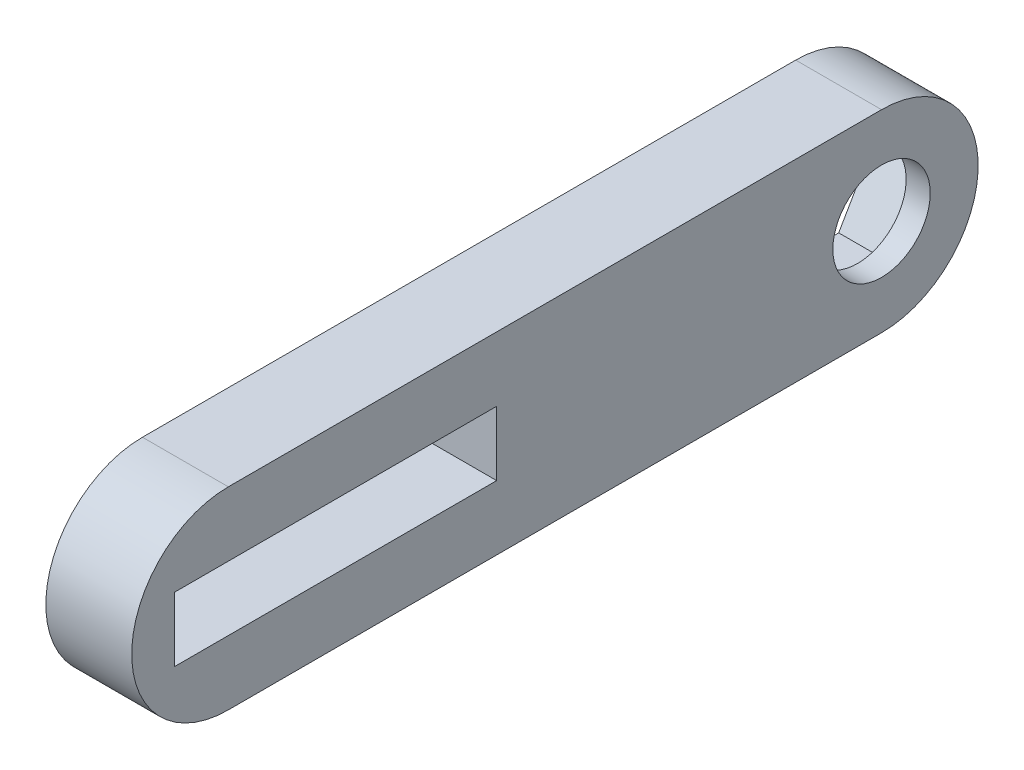
ISO-10303-21;
HEADER;
FILE_DESCRIPTION(('STEP AP214'),'2;1');
FILE_NAME('part.step','',(''),(''),'','','');
FILE_SCHEMA(('AUTOMOTIVE_DESIGN { 1 0 10303 214 1 1 1 1 }'));
ENDSEC;
DATA;
#1=APPLICATION_CONTEXT('core data for automotive mechanical design processes');
#2=APPLICATION_PROTOCOL_DEFINITION('international standard','automotive_design',2000,#1);
#3=PRODUCT_CONTEXT('',#1,'mechanical');
#4=PRODUCT('Part','Part','',(#3));
#5=PRODUCT_RELATED_PRODUCT_CATEGORY('part','',(#4));
#6=PRODUCT_DEFINITION_FORMATION('','',#4);
#7=PRODUCT_DEFINITION_CONTEXT('part definition',#1,'design');
#8=PRODUCT_DEFINITION('design','',#6,#7);
#9=PRODUCT_DEFINITION_SHAPE('','',#8);
#10=(LENGTH_UNIT() NAMED_UNIT(*) SI_UNIT(.MILLI.,.METRE.));
#11=(NAMED_UNIT(*) PLANE_ANGLE_UNIT() SI_UNIT($,.RADIAN.));
#12=(NAMED_UNIT(*) SI_UNIT($,.STERADIAN.) SOLID_ANGLE_UNIT());
#13=UNCERTAINTY_MEASURE_WITH_UNIT(LENGTH_MEASURE(1.E-05),#10,'distance_accuracy_value','');
#14=(GEOMETRIC_REPRESENTATION_CONTEXT(3) GLOBAL_UNCERTAINTY_ASSIGNED_CONTEXT((#13)) GLOBAL_UNIT_ASSIGNED_CONTEXT((#10,
#11,#12)) REPRESENTATION_CONTEXT('',''));
#15=CARTESIAN_POINT('',(0.,0.,0.));
#16=DIRECTION('',(0.,0.,1.));
#17=DIRECTION('',(1.,0.,0.));
#18=AXIS2_PLACEMENT_3D('',#15,#16,#17);
#19=CARTESIAN_POINT('',(0.,0.,-12.075480167));
#20=DIRECTION('',(-1.,0.,0.));
#21=DIRECTION('',(0.,0.,1.));
#22=AXIS2_PLACEMENT_3D('',#19,#20,#21);
#23=CYLINDRICAL_SURFACE('',#22,1.8);
#24=CARTESIAN_POINT('',(3.175,0.,-12.075480167));
#25=DIRECTION('',(1.,0.,0.));
#26=DIRECTION('',(0.,0.,-1.));
#27=AXIS2_PLACEMENT_3D('',#24,#25,#26);
#28=CIRCLE('',#27,1.8);
#29=CARTESIAN_POINT('',(3.175,0.,-13.875480167));
#30=VERTEX_POINT('',#29);
#31=EDGE_CURVE('E217',#30,#30,#28,.T.);
#32=ORIENTED_EDGE('',*,*,#31,.T.);
#33=EDGE_LOOP('',(#32));
#34=FACE_BOUND('',#33,.T.);
#35=CARTESIAN_POINT('',(2.286,0.,-12.075480167));
#36=DIRECTION('',(-1.,0.,0.));
#37=DIRECTION('',(0.,0.,1.));
#38=AXIS2_PLACEMENT_3D('',#35,#36,#37);
#39=CIRCLE('',#38,1.8);
#40=CARTESIAN_POINT('',(2.286,0.,-10.275480167));
#41=VERTEX_POINT('',#40);
#42=EDGE_CURVE('E39',#41,#41,#39,.F.);
#43=ORIENTED_EDGE('',*,*,#42,.F.);
#44=EDGE_LOOP('',(#43));
#45=FACE_BOUND('',#44,.T.);
#46=ADVANCED_FACE('F35',(#34,#45),#23,.F.);
#47=CARTESIAN_POINT('',(3.175,0.,12.075480167));
#48=DIRECTION('',(-1.,0.,0.));
#49=DIRECTION('',(0.,0.,1.));
#50=AXIS2_PLACEMENT_3D('',#47,#48,#49);
#51=CYLINDRICAL_SURFACE('',#50,3.571875);
#52=CARTESIAN_POINT('',(0.,0.,12.075480167));
#53=DIRECTION('',(1.,0.,0.));
#54=DIRECTION('',(0.,0.,-1.));
#55=AXIS2_PLACEMENT_3D('',#52,#53,#54);
#56=CIRCLE('',#55,3.571875);
#57=CARTESIAN_POINT('',(0.,3.571875,12.075480167));
#58=VERTEX_POINT('',#57);
#59=CARTESIAN_POINT('',(0.,-3.571875,12.075480167));
#60=VERTEX_POINT('',#59);
#61=EDGE_CURVE('E235',#58,#60,#56,.T.);
#62=ORIENTED_EDGE('',*,*,#61,.T.);
#63=DIRECTION('',(-1.,0.,0.));
#64=VECTOR('',#63,1.);
#65=CARTESIAN_POINT('',(3.175,-3.571875,12.075480167));
#66=LINE('',#65,#64);
#67=CARTESIAN_POINT('',(3.175,-3.571875,12.075480167));
#68=VERTEX_POINT('',#67);
#69=EDGE_CURVE('E11',#68,#60,#66,.T.);
#70=ORIENTED_EDGE('',*,*,#69,.F.);
#71=CARTESIAN_POINT('',(3.175,0.,12.075480167));
#72=DIRECTION('',(1.,0.,0.));
#73=DIRECTION('',(0.,0.,-1.));
#74=AXIS2_PLACEMENT_3D('',#71,#72,#73);
#75=CIRCLE('',#74,3.571875);
#76=CARTESIAN_POINT('',(3.175,3.571875,12.075480167));
#77=VERTEX_POINT('',#76);
#78=EDGE_CURVE('E224',#77,#68,#75,.T.);
#79=ORIENTED_EDGE('',*,*,#78,.F.);
#80=DIRECTION('',(-1.,0.,0.));
#81=VECTOR('',#80,1.);
#82=CARTESIAN_POINT('',(3.175,3.571875,12.075480167));
#83=LINE('',#82,#81);
#84=EDGE_CURVE('E234',#77,#58,#83,.T.);
#85=ORIENTED_EDGE('',*,*,#84,.T.);
#86=EDGE_LOOP('',(#62,#70,#79,#85));
#87=FACE_BOUND('',#86,.T.);
#88=ADVANCED_FACE('F37',(#87),#51,.T.);
#89=CARTESIAN_POINT('',(3.175,-3.571875,12.075480167));
#90=DIRECTION('',(0.,1.,0.));
#91=DIRECTION('',(0.,0.,1.));
#92=AXIS2_PLACEMENT_3D('',#89,#90,#91);
#93=PLANE('',#92);
#94=DIRECTION('',(0.,0.,-1.));
#95=VECTOR('',#94,1.);
#96=CARTESIAN_POINT('',(0.,-3.571875,12.075480167));
#97=LINE('',#96,#95);
#98=CARTESIAN_POINT('',(0.,-3.571875,-12.075480167));
#99=VERTEX_POINT('',#98);
#100=EDGE_CURVE('E238',#60,#99,#97,.T.);
#101=ORIENTED_EDGE('',*,*,#100,.T.);
#102=DIRECTION('',(-1.,0.,0.));
#103=VECTOR('',#102,1.);
#104=CARTESIAN_POINT('',(3.175,-3.571875,-12.075480167));
#105=LINE('',#104,#103);
#106=CARTESIAN_POINT('',(3.175,-3.571875,-12.075480167));
#107=VERTEX_POINT('',#106);
#108=EDGE_CURVE('E44',#107,#99,#105,.T.);
#109=ORIENTED_EDGE('',*,*,#108,.F.);
#110=DIRECTION('',(0.,0.,-1.));
#111=VECTOR('',#110,1.);
#112=CARTESIAN_POINT('',(3.175,-3.571875,12.075480167));
#113=LINE('',#112,#111);
#114=EDGE_CURVE('E227',#68,#107,#113,.T.);
#115=ORIENTED_EDGE('',*,*,#114,.F.);
#116=ORIENTED_EDGE('',*,*,#69,.T.);
#117=EDGE_LOOP('',(#101,#109,#115,#116));
#118=FACE_BOUND('',#117,.T.);
#119=ADVANCED_FACE('F269',(#118),#93,.F.);
#120=CARTESIAN_POINT('',(3.175,0.,-12.075480167));
#121=DIRECTION('',(-1.,0.,0.));
#122=DIRECTION('',(0.,0.,1.));
#123=AXIS2_PLACEMENT_3D('',#120,#121,#122);
#124=CYLINDRICAL_SURFACE('',#123,3.571875);
#125=CARTESIAN_POINT('',(0.,0.,-12.075480167));
#126=DIRECTION('',(1.,0.,0.));
#127=DIRECTION('',(0.,0.,-1.));
#128=AXIS2_PLACEMENT_3D('',#125,#126,#127);
#129=CIRCLE('',#128,3.571875);
#130=CARTESIAN_POINT('',(0.,3.571875,-12.075480167));
#131=VERTEX_POINT('',#130);
#132=EDGE_CURVE('E240',#99,#131,#129,.T.);
#133=ORIENTED_EDGE('',*,*,#132,.T.);
#134=DIRECTION('',(-1.,0.,0.));
#135=VECTOR('',#134,1.);
#136=CARTESIAN_POINT('',(3.175,3.571875,-12.075480167));
#137=LINE('',#136,#135);
#138=CARTESIAN_POINT('',(3.175,3.571875,-12.075480167));
#139=VERTEX_POINT('',#138);
#140=EDGE_CURVE('E245',#139,#131,#137,.T.);
#141=ORIENTED_EDGE('',*,*,#140,.F.);
#142=CARTESIAN_POINT('',(3.175,0.,-12.075480167));
#143=DIRECTION('',(1.,0.,0.));
#144=DIRECTION('',(0.,0.,-1.));
#145=AXIS2_PLACEMENT_3D('',#142,#143,#144);
#146=CIRCLE('',#145,3.571875);
#147=EDGE_CURVE('E230',#107,#139,#146,.T.);
#148=ORIENTED_EDGE('',*,*,#147,.F.);
#149=ORIENTED_EDGE('',*,*,#108,.T.);
#150=EDGE_LOOP('',(#133,#141,#148,#149));
#151=FACE_BOUND('',#150,.T.);
#152=ADVANCED_FACE('F274',(#151),#124,.T.);
#153=CARTESIAN_POINT('',(3.175,3.571875,12.075480167));
#154=DIRECTION('',(0.,-1.,0.));
#155=DIRECTION('',(0.,0.,-1.));
#156=AXIS2_PLACEMENT_3D('',#153,#154,#155);
#157=PLANE('',#156);
#158=DIRECTION('',(0.,0.,1.));
#159=VECTOR('',#158,1.);
#160=CARTESIAN_POINT('',(0.,3.571875,12.075480167));
#161=LINE('',#160,#159);
#162=EDGE_CURVE('E228',#131,#58,#161,.T.);
#163=ORIENTED_EDGE('',*,*,#162,.T.);
#164=ORIENTED_EDGE('',*,*,#84,.F.);
#165=DIRECTION('',(0.,0.,1.));
#166=VECTOR('',#165,1.);
#167=CARTESIAN_POINT('',(3.175,3.571875,12.075480167));
#168=LINE('',#167,#166);
#169=EDGE_CURVE('E232',#139,#77,#168,.T.);
#170=ORIENTED_EDGE('',*,*,#169,.F.);
#171=ORIENTED_EDGE('',*,*,#140,.T.);
#172=EDGE_LOOP('',(#163,#164,#170,#171));
#173=FACE_BOUND('',#172,.T.);
#174=ADVANCED_FACE('F258',(#173),#157,.F.);
#175=CARTESIAN_POINT('',(3.175,0.,12.075480167));
#176=DIRECTION('',(1.,0.,0.));
#177=DIRECTION('',(0.,0.,-1.));
#178=AXIS2_PLACEMENT_3D('',#175,#176,#177);
#179=PLANE('',#178);
#180=DIRECTION('',(0.,1.,0.));
#181=VECTOR('',#180,1.);
#182=CARTESIAN_POINT('',(3.175,-1.190625,14.059855167));
#183=LINE('',#182,#181);
#184=CARTESIAN_POINT('',(3.175,-1.190625,14.059855167));
#185=VERTEX_POINT('',#184);
#186=CARTESIAN_POINT('',(3.175,1.190625,14.059855167));
#187=VERTEX_POINT('',#186);
#188=EDGE_CURVE('E193',#185,#187,#183,.T.);
#189=ORIENTED_EDGE('',*,*,#188,.T.);
#190=DIRECTION('',(0.,0.,-1.));
#191=VECTOR('',#190,1.);
#192=CARTESIAN_POINT('',(3.175,1.190625,2.153605167));
#193=LINE('',#192,#191);
#194=CARTESIAN_POINT('',(3.175,1.190625,2.153605167));
#195=VERTEX_POINT('',#194);
#196=EDGE_CURVE('E196',#187,#195,#193,.T.);
#197=ORIENTED_EDGE('',*,*,#196,.T.);
#198=DIRECTION('',(0.,-1.,0.));
#199=VECTOR('',#198,1.);
#200=CARTESIAN_POINT('',(3.175,-1.190625,2.153605167));
#201=LINE('',#200,#199);
#202=CARTESIAN_POINT('',(3.175,-1.190625,2.153605167));
#203=VERTEX_POINT('',#202);
#204=EDGE_CURVE('E60',#195,#203,#201,.T.);
#205=ORIENTED_EDGE('',*,*,#204,.T.);
#206=DIRECTION('',(0.,0.,1.));
#207=VECTOR('',#206,1.);
#208=CARTESIAN_POINT('',(3.175,-1.190625,2.153605167));
#209=LINE('',#208,#207);
#210=EDGE_CURVE('E201',#203,#185,#209,.T.);
#211=ORIENTED_EDGE('',*,*,#210,.T.);
#212=EDGE_LOOP('',(#189,#197,#205,#211));
#213=FACE_BOUND('',#212,.T.);
#214=ORIENTED_EDGE('',*,*,#31,.F.);
#215=EDGE_LOOP('',(#214));
#216=FACE_BOUND('',#215,.T.);
#217=ORIENTED_EDGE('',*,*,#78,.T.);
#218=ORIENTED_EDGE('',*,*,#114,.T.);
#219=ORIENTED_EDGE('',*,*,#147,.T.);
#220=ORIENTED_EDGE('',*,*,#169,.T.);
#221=EDGE_LOOP('',(#217,#218,#219,#220));
#222=FACE_BOUND('',#221,.T.);
#223=ADVANCED_FACE('F254',(#213,#216,#222),#179,.T.);
#224=CARTESIAN_POINT('',(0.,0.,12.075480167));
#225=DIRECTION('',(1.,0.,0.));
#226=DIRECTION('',(0.,0.,-1.));
#227=AXIS2_PLACEMENT_3D('',#224,#225,#226);
#228=PLANE('',#227);
#229=DIRECTION('',(0.,0.866025403784439,0.5));
#230=VECTOR('',#229,1.);
#231=CARTESIAN_POINT('',(0.,-2.7559,-10.4843605601403));
#232=LINE('',#231,#230);
#233=CARTESIAN_POINT('',(0.,-2.7559,-10.4843605601403));
#234=VERTEX_POINT('',#233);
#235=CARTESIAN_POINT('',(0.,0.,-8.89324095328062));
#236=VERTEX_POINT('',#235);
#237=EDGE_CURVE('E174',#234,#236,#232,.T.);
#238=ORIENTED_EDGE('',*,*,#237,.F.);
#239=DIRECTION('',(0.,0.,1.));
#240=VECTOR('',#239,1.);
#241=CARTESIAN_POINT('',(0.,-2.7559,-13.6665997738597));
#242=LINE('',#241,#240);
#243=CARTESIAN_POINT('',(0.,-2.7559,-13.6665997738597));
#244=VERTEX_POINT('',#243);
#245=EDGE_CURVE('E52',#244,#234,#242,.T.);
#246=ORIENTED_EDGE('',*,*,#245,.F.);
#247=DIRECTION('',(0.,-0.866025403784438,0.5));
#248=VECTOR('',#247,1.);
#249=CARTESIAN_POINT('',(0.,0.,-15.2577193807194));
#250=LINE('',#249,#248);
#251=CARTESIAN_POINT('',(0.,0.,-15.2577193807194));
#252=VERTEX_POINT('',#251);
#253=EDGE_CURVE('E160',#252,#244,#250,.T.);
#254=ORIENTED_EDGE('',*,*,#253,.F.);
#255=DIRECTION('',(0.,-0.866025403784439,-0.5));
#256=VECTOR('',#255,1.);
#257=CARTESIAN_POINT('',(0.,2.7559,-13.6665997738597));
#258=LINE('',#257,#256);
#259=CARTESIAN_POINT('',(0.,2.7559,-13.6665997738597));
#260=VERTEX_POINT('',#259);
#261=EDGE_CURVE('E163',#260,#252,#258,.T.);
#262=ORIENTED_EDGE('',*,*,#261,.F.);
#263=DIRECTION('',(0.,0.,-1.));
#264=VECTOR('',#263,1.);
#265=CARTESIAN_POINT('',(0.,2.7559,-10.4843605601403));
#266=LINE('',#265,#264);
#267=CARTESIAN_POINT('',(0.,2.7559,-10.4843605601403));
#268=VERTEX_POINT('',#267);
#269=EDGE_CURVE('E179',#268,#260,#266,.T.);
#270=ORIENTED_EDGE('',*,*,#269,.F.);
#271=DIRECTION('',(0.,0.866025403784438,-0.5));
#272=VECTOR('',#271,1.);
#273=CARTESIAN_POINT('',(0.,0.,-8.89324095328062));
#274=LINE('',#273,#272);
#275=EDGE_CURVE('E176',#236,#268,#274,.T.);
#276=ORIENTED_EDGE('',*,*,#275,.F.);
#277=EDGE_LOOP('',(#238,#246,#254,#262,#270,#276));
#278=FACE_BOUND('',#277,.T.);
#279=DIRECTION('',(0.,0.,-1.));
#280=VECTOR('',#279,1.);
#281=CARTESIAN_POINT('',(0.,1.190625,2.153605167));
#282=LINE('',#281,#280);
#283=CARTESIAN_POINT('',(0.,1.190625,14.059855167));
#284=VERTEX_POINT('',#283);
#285=CARTESIAN_POINT('',(0.,1.190625,2.153605167));
#286=VERTEX_POINT('',#285);
#287=EDGE_CURVE('E207',#284,#286,#282,.T.);
#288=ORIENTED_EDGE('',*,*,#287,.F.);
#289=DIRECTION('',(0.,1.,0.));
#290=VECTOR('',#289,1.);
#291=CARTESIAN_POINT('',(0.,-1.190625,14.059855167));
#292=LINE('',#291,#290);
#293=CARTESIAN_POINT('',(0.,-1.190625,14.059855167));
#294=VERTEX_POINT('',#293);
#295=EDGE_CURVE('E205',#294,#284,#292,.T.);
#296=ORIENTED_EDGE('',*,*,#295,.F.);
#297=DIRECTION('',(0.,0.,1.));
#298=VECTOR('',#297,1.);
#299=CARTESIAN_POINT('',(0.,-1.190625,2.153605167));
#300=LINE('',#299,#298);
#301=CARTESIAN_POINT('',(0.,-1.190625,2.153605167));
#302=VERTEX_POINT('',#301);
#303=EDGE_CURVE('E197',#302,#294,#300,.T.);
#304=ORIENTED_EDGE('',*,*,#303,.F.);
#305=DIRECTION('',(0.,-1.,0.));
#306=VECTOR('',#305,1.);
#307=CARTESIAN_POINT('',(0.,-1.190625,2.153605167));
#308=LINE('',#307,#306);
#309=EDGE_CURVE('E210',#286,#302,#308,.T.);
#310=ORIENTED_EDGE('',*,*,#309,.F.);
#311=EDGE_LOOP('',(#288,#296,#304,#310));
#312=FACE_BOUND('',#311,.T.);
#313=ORIENTED_EDGE('',*,*,#61,.F.);
#314=ORIENTED_EDGE('',*,*,#162,.F.);
#315=ORIENTED_EDGE('',*,*,#132,.F.);
#316=ORIENTED_EDGE('',*,*,#100,.F.);
#317=EDGE_LOOP('',(#313,#314,#315,#316));
#318=FACE_BOUND('',#317,.T.);
#319=ADVANCED_FACE('F257',(#278,#312,#318),#228,.F.);
#320=CARTESIAN_POINT('',(3.175,-1.190625,14.059855167));
#321=DIRECTION('',(0.,0.,1.));
#322=DIRECTION('',(1.,0.,0.));
#323=AXIS2_PLACEMENT_3D('',#320,#321,#322);
#324=PLANE('',#323);
#325=ORIENTED_EDGE('',*,*,#295,.T.);
#326=DIRECTION('',(-1.,0.,0.));
#327=VECTOR('',#326,1.);
#328=CARTESIAN_POINT('',(3.175,1.190625,14.059855167));
#329=LINE('',#328,#327);
#330=EDGE_CURVE('E204',#187,#284,#329,.T.);
#331=ORIENTED_EDGE('',*,*,#330,.F.);
#332=ORIENTED_EDGE('',*,*,#188,.F.);
#333=DIRECTION('',(-1.,0.,0.));
#334=VECTOR('',#333,1.);
#335=CARTESIAN_POINT('',(3.175,-1.190625,14.059855167));
#336=LINE('',#335,#334);
#337=EDGE_CURVE('E215',#185,#294,#336,.T.);
#338=ORIENTED_EDGE('',*,*,#337,.T.);
#339=EDGE_LOOP('',(#325,#331,#332,#338));
#340=FACE_BOUND('',#339,.T.);
#341=ADVANCED_FACE('F279',(#340),#324,.F.);
#342=CARTESIAN_POINT('',(3.175,-1.190625,2.153605167));
#343=DIRECTION('',(0.,-1.,0.));
#344=DIRECTION('',(0.,0.,-1.));
#345=AXIS2_PLACEMENT_3D('',#342,#343,#344);
#346=PLANE('',#345);
#347=ORIENTED_EDGE('',*,*,#303,.T.);
#348=ORIENTED_EDGE('',*,*,#337,.F.);
#349=ORIENTED_EDGE('',*,*,#210,.F.);
#350=DIRECTION('',(-1.,0.,0.));
#351=VECTOR('',#350,1.);
#352=CARTESIAN_POINT('',(3.175,-1.190625,2.153605167));
#353=LINE('',#352,#351);
#354=EDGE_CURVE('E218',#203,#302,#353,.T.);
#355=ORIENTED_EDGE('',*,*,#354,.T.);
#356=EDGE_LOOP('',(#347,#348,#349,#355));
#357=FACE_BOUND('',#356,.T.);
#358=ADVANCED_FACE('F285',(#357),#346,.F.);
#359=CARTESIAN_POINT('',(3.175,-1.190625,2.153605167));
#360=DIRECTION('',(0.,0.,-1.));
#361=DIRECTION('',(-1.,0.,0.));
#362=AXIS2_PLACEMENT_3D('',#359,#360,#361);
#363=PLANE('',#362);
#364=ORIENTED_EDGE('',*,*,#309,.T.);
#365=ORIENTED_EDGE('',*,*,#354,.F.);
#366=ORIENTED_EDGE('',*,*,#204,.F.);
#367=DIRECTION('',(-1.,0.,0.));
#368=VECTOR('',#367,1.);
#369=CARTESIAN_POINT('',(3.175,1.190625,2.153605167));
#370=LINE('',#369,#368);
#371=EDGE_CURVE('E220',#195,#286,#370,.T.);
#372=ORIENTED_EDGE('',*,*,#371,.T.);
#373=EDGE_LOOP('',(#364,#365,#366,#372));
#374=FACE_BOUND('',#373,.T.);
#375=ADVANCED_FACE('F299',(#374),#363,.F.);
#376=CARTESIAN_POINT('',(3.175,1.190625,2.153605167));
#377=DIRECTION('',(0.,1.,0.));
#378=DIRECTION('',(0.,0.,1.));
#379=AXIS2_PLACEMENT_3D('',#376,#377,#378);
#380=PLANE('',#379);
#381=ORIENTED_EDGE('',*,*,#287,.T.);
#382=ORIENTED_EDGE('',*,*,#371,.F.);
#383=ORIENTED_EDGE('',*,*,#196,.F.);
#384=ORIENTED_EDGE('',*,*,#330,.T.);
#385=EDGE_LOOP('',(#381,#382,#383,#384));
#386=FACE_BOUND('',#385,.T.);
#387=ADVANCED_FACE('F296',(#386),#380,.F.);
#388=CARTESIAN_POINT('',(2.286,0.,0.));
#389=DIRECTION('',(-1.,0.,0.));
#390=DIRECTION('',(0.,0.,1.));
#391=AXIS2_PLACEMENT_3D('',#388,#389,#390);
#392=PLANE('',#391);
#393=DIRECTION('',(0.,0.,1.));
#394=VECTOR('',#393,1.);
#395=CARTESIAN_POINT('',(2.286,-2.7559,-13.6665997738597));
#396=LINE('',#395,#394);
#397=CARTESIAN_POINT('',(2.286,-2.7559,-13.6665997738597));
#398=VERTEX_POINT('',#397);
#399=CARTESIAN_POINT('',(2.286,-2.7559,-10.4843605601403));
#400=VERTEX_POINT('',#399);
#401=EDGE_CURVE('E140',#398,#400,#396,.T.);
#402=ORIENTED_EDGE('',*,*,#401,.T.);
#403=DIRECTION('',(0.,0.866025403784439,0.5));
#404=VECTOR('',#403,1.);
#405=CARTESIAN_POINT('',(2.286,-2.7559,-10.4843605601403));
#406=LINE('',#405,#404);
#407=CARTESIAN_POINT('',(2.286,0.,-8.89324095328062));
#408=VERTEX_POINT('',#407);
#409=EDGE_CURVE('E149',#400,#408,#406,.T.);
#410=ORIENTED_EDGE('',*,*,#409,.T.);
#411=DIRECTION('',(0.,0.866025403784438,-0.5));
#412=VECTOR('',#411,1.);
#413=CARTESIAN_POINT('',(2.286,0.,-8.89324095328062));
#414=LINE('',#413,#412);
#415=CARTESIAN_POINT('',(2.286,2.7559,-10.4843605601403));
#416=VERTEX_POINT('',#415);
#417=EDGE_CURVE('E154',#408,#416,#414,.T.);
#418=ORIENTED_EDGE('',*,*,#417,.T.);
#419=DIRECTION('',(0.,0.,-1.));
#420=VECTOR('',#419,1.);
#421=CARTESIAN_POINT('',(2.286,2.7559,-10.4843605601403));
#422=LINE('',#421,#420);
#423=CARTESIAN_POINT('',(2.286,2.7559,-13.6665997738597));
#424=VERTEX_POINT('',#423);
#425=EDGE_CURVE('E167',#416,#424,#422,.T.);
#426=ORIENTED_EDGE('',*,*,#425,.T.);
#427=DIRECTION('',(0.,-0.866025403784439,-0.5));
#428=VECTOR('',#427,1.);
#429=CARTESIAN_POINT('',(2.286,2.7559,-13.6665997738597));
#430=LINE('',#429,#428);
#431=CARTESIAN_POINT('',(2.286,0.,-15.2577193807194));
#432=VERTEX_POINT('',#431);
#433=EDGE_CURVE('E170',#424,#432,#430,.T.);
#434=ORIENTED_EDGE('',*,*,#433,.T.);
#435=DIRECTION('',(0.,-0.866025403784438,0.5));
#436=VECTOR('',#435,1.);
#437=CARTESIAN_POINT('',(2.286,0.,-15.2577193807194));
#438=LINE('',#437,#436);
#439=EDGE_CURVE('E146',#432,#398,#438,.T.);
#440=ORIENTED_EDGE('',*,*,#439,.T.);
#441=EDGE_LOOP('',(#402,#410,#418,#426,#434,#440));
#442=FACE_BOUND('',#441,.T.);
#443=ORIENTED_EDGE('',*,*,#42,.T.);
#444=EDGE_LOOP('',(#443));
#445=FACE_BOUND('',#444,.T.);
#446=ADVANCED_FACE('F156',(#442,#445),#392,.T.);
#447=CARTESIAN_POINT('',(2.286,-2.7559,-13.6665997738597));
#448=DIRECTION('',(0.,-1.,0.));
#449=DIRECTION('',(0.,0.,-1.));
#450=AXIS2_PLACEMENT_3D('',#447,#448,#449);
#451=PLANE('',#450);
#452=ORIENTED_EDGE('',*,*,#245,.T.);
#453=DIRECTION('',(-1.,0.,0.));
#454=VECTOR('',#453,1.);
#455=CARTESIAN_POINT('',(2.286,-2.7559,-10.4843605601403));
#456=LINE('',#455,#454);
#457=EDGE_CURVE('E136',#400,#234,#456,.T.);
#458=ORIENTED_EDGE('',*,*,#457,.F.);
#459=ORIENTED_EDGE('',*,*,#401,.F.);
#460=DIRECTION('',(-1.,0.,0.));
#461=VECTOR('',#460,1.);
#462=CARTESIAN_POINT('',(2.286,-2.7559,-13.6665997738597));
#463=LINE('',#462,#461);
#464=EDGE_CURVE('E184',#398,#244,#463,.T.);
#465=ORIENTED_EDGE('',*,*,#464,.T.);
#466=EDGE_LOOP('',(#452,#458,#459,#465));
#467=FACE_BOUND('',#466,.T.);
#468=ADVANCED_FACE('F138',(#467),#451,.F.);
#469=CARTESIAN_POINT('',(2.286,0.,-15.2577193807194));
#470=DIRECTION('',(0.,-0.5,-0.866025403784438));
#471=DIRECTION('',(0.,0.866025403784439,-0.5));
#472=AXIS2_PLACEMENT_3D('',#469,#470,#471);
#473=PLANE('',#472);
#474=ORIENTED_EDGE('',*,*,#253,.T.);
#475=ORIENTED_EDGE('',*,*,#464,.F.);
#476=ORIENTED_EDGE('',*,*,#439,.F.);
#477=DIRECTION('',(-1.,0.,0.));
#478=VECTOR('',#477,1.);
#479=CARTESIAN_POINT('',(2.286,0.,-15.2577193807194));
#480=LINE('',#479,#478);
#481=EDGE_CURVE('E186',#432,#252,#480,.T.);
#482=ORIENTED_EDGE('',*,*,#481,.T.);
#483=EDGE_LOOP('',(#474,#475,#476,#482));
#484=FACE_BOUND('',#483,.T.);
#485=ADVANCED_FACE('F308',(#484),#473,.F.);
#486=CARTESIAN_POINT('',(2.286,2.7559,-13.6665997738597));
#487=DIRECTION('',(0.,0.5,-0.866025403784439));
#488=DIRECTION('',(0.,0.866025403784439,0.5));
#489=AXIS2_PLACEMENT_3D('',#486,#487,#488);
#490=PLANE('',#489);
#491=ORIENTED_EDGE('',*,*,#261,.T.);
#492=ORIENTED_EDGE('',*,*,#481,.F.);
#493=ORIENTED_EDGE('',*,*,#433,.F.);
#494=DIRECTION('',(-1.,0.,0.));
#495=VECTOR('',#494,1.);
#496=CARTESIAN_POINT('',(2.286,2.7559,-13.6665997738597));
#497=LINE('',#496,#495);
#498=EDGE_CURVE('E188',#424,#260,#497,.T.);
#499=ORIENTED_EDGE('',*,*,#498,.T.);
#500=EDGE_LOOP('',(#491,#492,#493,#499));
#501=FACE_BOUND('',#500,.T.);
#502=ADVANCED_FACE('F318',(#501),#490,.F.);
#503=CARTESIAN_POINT('',(2.286,2.7559,-10.4843605601403));
#504=DIRECTION('',(0.,1.,0.));
#505=DIRECTION('',(0.,0.,1.));
#506=AXIS2_PLACEMENT_3D('',#503,#504,#505);
#507=PLANE('',#506);
#508=ORIENTED_EDGE('',*,*,#269,.T.);
#509=ORIENTED_EDGE('',*,*,#498,.F.);
#510=ORIENTED_EDGE('',*,*,#425,.F.);
#511=DIRECTION('',(-1.,0.,0.));
#512=VECTOR('',#511,1.);
#513=CARTESIAN_POINT('',(2.286,2.7559,-10.4843605601403));
#514=LINE('',#513,#512);
#515=EDGE_CURVE('E190',#416,#268,#514,.T.);
#516=ORIENTED_EDGE('',*,*,#515,.T.);
#517=EDGE_LOOP('',(#508,#509,#510,#516));
#518=FACE_BOUND('',#517,.T.);
#519=ADVANCED_FACE('F314',(#518),#507,.F.);
#520=CARTESIAN_POINT('',(2.286,0.,-8.89324095328062));
#521=DIRECTION('',(0.,0.5,0.866025403784438));
#522=DIRECTION('',(0.,-0.866025403784439,0.5));
#523=AXIS2_PLACEMENT_3D('',#520,#521,#522);
#524=PLANE('',#523);
#525=ORIENTED_EDGE('',*,*,#275,.T.);
#526=ORIENTED_EDGE('',*,*,#515,.F.);
#527=ORIENTED_EDGE('',*,*,#417,.F.);
#528=DIRECTION('',(-1.,0.,0.));
#529=VECTOR('',#528,1.);
#530=CARTESIAN_POINT('',(2.286,0.,-8.89324095328062));
#531=LINE('',#530,#529);
#532=EDGE_CURVE('E145',#408,#236,#531,.T.);
#533=ORIENTED_EDGE('',*,*,#532,.T.);
#534=EDGE_LOOP('',(#525,#526,#527,#533));
#535=FACE_BOUND('',#534,.T.);
#536=ADVANCED_FACE('F311',(#535),#524,.F.);
#537=CARTESIAN_POINT('',(2.286,-2.7559,-10.4843605601403));
#538=DIRECTION('',(0.,-0.5,0.866025403784439));
#539=DIRECTION('',(0.,-0.866025403784439,-0.5));
#540=AXIS2_PLACEMENT_3D('',#537,#538,#539);
#541=PLANE('',#540);
#542=ORIENTED_EDGE('',*,*,#237,.T.);
#543=ORIENTED_EDGE('',*,*,#532,.F.);
#544=ORIENTED_EDGE('',*,*,#409,.F.);
#545=ORIENTED_EDGE('',*,*,#457,.T.);
#546=EDGE_LOOP('',(#542,#543,#544,#545));
#547=FACE_BOUND('',#546,.T.);
#548=ADVANCED_FACE('F150',(#547),#541,.F.);
#549=CLOSED_SHELL('',(#46,#88,#119,#152,#174,#223,#319,#341,#358,#375,#387,#446,#468,#485,#502,
#519,#536,#548));
#550=MANIFOLD_SOLID_BREP('B2',#549);
#551=ADVANCED_BREP_SHAPE_REPRESENTATION('',(#18,#550),#14);
#552=SHAPE_DEFINITION_REPRESENTATION(#9,#551);
ENDSEC;
END-ISO-10303-21;
